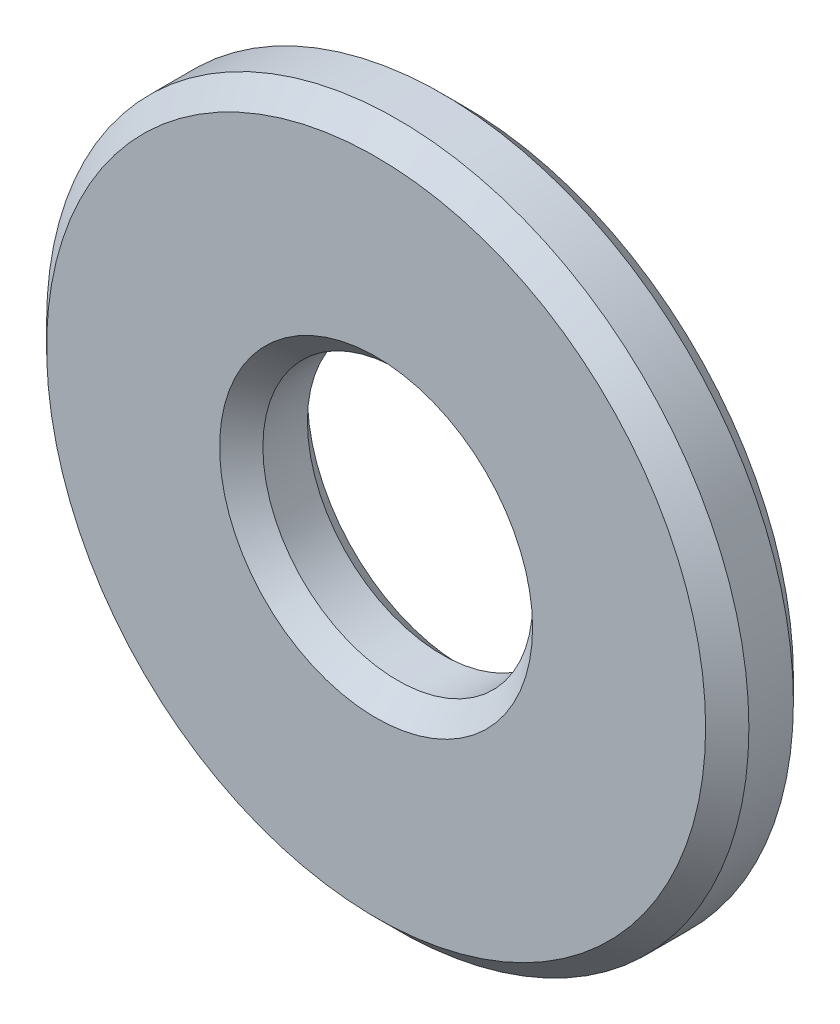
ISO-10303-21;
HEADER;
FILE_DESCRIPTION(('STEP AP214'),'2;1');
FILE_NAME('part.step','',(''),(''),'','','');
FILE_SCHEMA(('AUTOMOTIVE_DESIGN { 1 0 10303 214 1 1 1 1 }'));
ENDSEC;
DATA;
#1=APPLICATION_CONTEXT('core data for automotive mechanical design processes');
#2=APPLICATION_PROTOCOL_DEFINITION('international standard','automotive_design',2000,#1);
#3=PRODUCT_CONTEXT('',#1,'mechanical');
#4=PRODUCT('Part','Part','',(#3));
#5=PRODUCT_RELATED_PRODUCT_CATEGORY('part','',(#4));
#6=PRODUCT_DEFINITION_FORMATION('','',#4);
#7=PRODUCT_DEFINITION_CONTEXT('part definition',#1,'design');
#8=PRODUCT_DEFINITION('design','',#6,#7);
#9=PRODUCT_DEFINITION_SHAPE('','',#8);
#10=(LENGTH_UNIT() NAMED_UNIT(*) SI_UNIT(.MILLI.,.METRE.));
#11=(NAMED_UNIT(*) PLANE_ANGLE_UNIT() SI_UNIT($,.RADIAN.));
#12=(NAMED_UNIT(*) SI_UNIT($,.STERADIAN.) SOLID_ANGLE_UNIT());
#13=UNCERTAINTY_MEASURE_WITH_UNIT(LENGTH_MEASURE(1.E-05),#10,'distance_accuracy_value','');
#14=(GEOMETRIC_REPRESENTATION_CONTEXT(3) GLOBAL_UNCERTAINTY_ASSIGNED_CONTEXT((#13)) GLOBAL_UNIT_ASSIGNED_CONTEXT((#10,
#11,#12)) REPRESENTATION_CONTEXT('',''));
#15=CARTESIAN_POINT('',(0.,0.,0.));
#16=DIRECTION('',(0.,0.,1.));
#17=DIRECTION('',(1.,0.,0.));
#18=AXIS2_PLACEMENT_3D('',#15,#16,#17);
#19=CARTESIAN_POINT('',(0.,0.,-0.79375));
#20=DIRECTION('',(0.,0.,1.));
#21=DIRECTION('',(1.,0.,0.));
#22=AXIS2_PLACEMENT_3D('',#19,#20,#21);
#23=CYLINDRICAL_SURFACE('',#22,6.35);
#24=CARTESIAN_POINT('',(0.,0.,0.402590000000001));
#25=DIRECTION('',(0.,0.,1.));
#26=DIRECTION('',(1.,0.,0.));
#27=AXIS2_PLACEMENT_3D('',#24,#25,#26);
#28=CIRCLE('',#27,6.35);
#29=CARTESIAN_POINT('',(6.35,0.,0.402590000000001));
#30=VERTEX_POINT('',#29);
#31=EDGE_CURVE('E55',#30,#30,#28,.F.);
#32=ORIENTED_EDGE('',*,*,#31,.T.);
#33=EDGE_LOOP('',(#32));
#34=FACE_BOUND('',#33,.T.);
#35=CARTESIAN_POINT('',(0.,0.,-0.402590000000001));
#36=DIRECTION('',(0.,0.,1.));
#37=DIRECTION('',(1.,0.,0.));
#38=AXIS2_PLACEMENT_3D('',#35,#36,#37);
#39=CIRCLE('',#38,6.35);
#40=CARTESIAN_POINT('',(6.35,0.,-0.402590000000001));
#41=VERTEX_POINT('',#40);
#42=EDGE_CURVE('E58',#41,#41,#39,.T.);
#43=ORIENTED_EDGE('',*,*,#42,.T.);
#44=EDGE_LOOP('',(#43));
#45=FACE_BOUND('',#44,.T.);
#46=ADVANCED_FACE('F35',(#34,#45),#23,.T.);
#47=CARTESIAN_POINT('',(0.,0.,-0.79375));
#48=DIRECTION('',(0.,0.,1.));
#49=DIRECTION('',(1.,0.,0.));
#50=AXIS2_PLACEMENT_3D('',#47,#48,#49);
#51=PLANE('',#50);
#52=CARTESIAN_POINT('',(0.,0.,-0.79375));
#53=DIRECTION('',(0.,0.,1.));
#54=DIRECTION('',(1.,0.,0.));
#55=AXIS2_PLACEMENT_3D('',#52,#53,#54);
#56=CIRCLE('',#55,5.95884);
#57=CARTESIAN_POINT('',(5.95884,0.,-0.79375));
#58=VERTEX_POINT('',#57);
#59=EDGE_CURVE('E46',#58,#58,#56,.F.);
#60=ORIENTED_EDGE('',*,*,#59,.T.);
#61=EDGE_LOOP('',(#60));
#62=FACE_BOUND('',#61,.T.);
#63=CARTESIAN_POINT('',(0.,0.,-0.79375));
#64=DIRECTION('',(0.,0.,1.));
#65=DIRECTION('',(1.,0.,0.));
#66=AXIS2_PLACEMENT_3D('',#63,#64,#65);
#67=CIRCLE('',#66,2.82956000000001);
#68=CARTESIAN_POINT('',(2.82956000000001,0.,-0.79375));
#69=VERTEX_POINT('',#68);
#70=EDGE_CURVE('E50',#69,#69,#67,.T.);
#71=ORIENTED_EDGE('',*,*,#70,.T.);
#72=EDGE_LOOP('',(#71));
#73=FACE_BOUND('',#72,.T.);
#74=ADVANCED_FACE('F83',(#62,#73),#51,.F.);
#75=CARTESIAN_POINT('',(0.,0.,-0.79375));
#76=DIRECTION('',(0.,0.,1.));
#77=DIRECTION('',(1.,0.,0.));
#78=AXIS2_PLACEMENT_3D('',#75,#76,#77);
#79=CYLINDRICAL_SURFACE('',#78,2.4384);
#80=CARTESIAN_POINT('',(0.,0.,0.402590000000001));
#81=DIRECTION('',(0.,0.,1.));
#82=DIRECTION('',(1.,0.,0.));
#83=AXIS2_PLACEMENT_3D('',#80,#81,#82);
#84=CIRCLE('',#83,2.4384);
#85=CARTESIAN_POINT('',(2.4384,0.,0.402590000000001));
#86=VERTEX_POINT('',#85);
#87=EDGE_CURVE('E10',#86,#86,#84,.T.);
#88=ORIENTED_EDGE('',*,*,#87,.T.);
#89=EDGE_LOOP('',(#88));
#90=FACE_BOUND('',#89,.T.);
#91=CARTESIAN_POINT('',(0.,0.,-0.402589999999994));
#92=DIRECTION('',(0.,0.,1.));
#93=DIRECTION('',(1.,0.,0.));
#94=AXIS2_PLACEMENT_3D('',#91,#92,#93);
#95=CIRCLE('',#94,2.4384);
#96=CARTESIAN_POINT('',(2.4384,0.,-0.402589999999994));
#97=VERTEX_POINT('',#96);
#98=EDGE_CURVE('E42',#97,#97,#95,.F.);
#99=ORIENTED_EDGE('',*,*,#98,.T.);
#100=EDGE_LOOP('',(#99));
#101=FACE_BOUND('',#100,.T.);
#102=ADVANCED_FACE('F89',(#90,#101),#79,.F.);
#103=CARTESIAN_POINT('',(0.,0.,0.79375));
#104=DIRECTION('',(0.,0.,1.));
#105=DIRECTION('',(1.,0.,0.));
#106=AXIS2_PLACEMENT_3D('',#103,#104,#105);
#107=PLANE('',#106);
#108=CARTESIAN_POINT('',(0.,0.,0.79375));
#109=DIRECTION('',(0.,0.,1.));
#110=DIRECTION('',(1.,0.,0.));
#111=AXIS2_PLACEMENT_3D('',#108,#109,#110);
#112=CIRCLE('',#111,5.95884);
#113=CARTESIAN_POINT('',(5.95884,0.,0.79375));
#114=VERTEX_POINT('',#113);
#115=EDGE_CURVE('E61',#114,#114,#112,.T.);
#116=ORIENTED_EDGE('',*,*,#115,.T.);
#117=EDGE_LOOP('',(#116));
#118=FACE_BOUND('',#117,.T.);
#119=CARTESIAN_POINT('',(0.,0.,0.79375));
#120=DIRECTION('',(0.,0.,1.));
#121=DIRECTION('',(1.,0.,0.));
#122=AXIS2_PLACEMENT_3D('',#119,#120,#121);
#123=CIRCLE('',#122,2.82956);
#124=CARTESIAN_POINT('',(2.82956,0.,0.79375));
#125=VERTEX_POINT('',#124);
#126=EDGE_CURVE('E64',#125,#125,#123,.F.);
#127=ORIENTED_EDGE('',*,*,#126,.T.);
#128=EDGE_LOOP('',(#127));
#129=FACE_BOUND('',#128,.T.);
#130=ADVANCED_FACE('F68',(#118,#129),#107,.T.);
#131=CARTESIAN_POINT('',(0.,0.,0.79375));
#132=DIRECTION('',(0.,0.,-1.));
#133=DIRECTION('',(-1.,0.,0.));
#134=AXIS2_PLACEMENT_3D('',#131,#132,#133);
#135=CONICAL_SURFACE('',#134,5.95884,0.785398163397449);
#136=ORIENTED_EDGE('',*,*,#31,.F.);
#137=EDGE_LOOP('',(#136));
#138=FACE_BOUND('',#137,.T.);
#139=ORIENTED_EDGE('',*,*,#115,.F.);
#140=EDGE_LOOP('',(#139));
#141=FACE_BOUND('',#140,.T.);
#142=ADVANCED_FACE('F79',(#138,#141),#135,.T.);
#143=CARTESIAN_POINT('',(0.,0.,-0.402590000000001));
#144=DIRECTION('',(0.,0.,1.));
#145=DIRECTION('',(1.,0.,0.));
#146=AXIS2_PLACEMENT_3D('',#143,#144,#145);
#147=CONICAL_SURFACE('',#146,6.35,0.785398163397449);
#148=ORIENTED_EDGE('',*,*,#59,.F.);
#149=EDGE_LOOP('',(#148));
#150=FACE_BOUND('',#149,.T.);
#151=ORIENTED_EDGE('',*,*,#42,.F.);
#152=EDGE_LOOP('',(#151));
#153=FACE_BOUND('',#152,.T.);
#154=ADVANCED_FACE('F73',(#150,#153),#147,.T.);
#155=CARTESIAN_POINT('',(0.,0.,0.402590000000001));
#156=DIRECTION('',(0.,0.,1.));
#157=DIRECTION('',(1.,0.,0.));
#158=AXIS2_PLACEMENT_3D('',#155,#156,#157);
#159=CONICAL_SURFACE('',#158,2.4384,0.785398163397449);
#160=ORIENTED_EDGE('',*,*,#126,.F.);
#161=EDGE_LOOP('',(#160));
#162=FACE_BOUND('',#161,.T.);
#163=ORIENTED_EDGE('',*,*,#87,.F.);
#164=EDGE_LOOP('',(#163));
#165=FACE_BOUND('',#164,.T.);
#166=ADVANCED_FACE('F70',(#162,#165),#159,.F.);
#167=CARTESIAN_POINT('',(0.,0.,-0.79375));
#168=DIRECTION('',(0.,0.,-1.));
#169=DIRECTION('',(-1.,0.,0.));
#170=AXIS2_PLACEMENT_3D('',#167,#168,#169);
#171=CONICAL_SURFACE('',#170,2.82956000000001,0.785398163397447);
#172=ORIENTED_EDGE('',*,*,#98,.F.);
#173=EDGE_LOOP('',(#172));
#174=FACE_BOUND('',#173,.T.);
#175=ORIENTED_EDGE('',*,*,#70,.F.);
#176=EDGE_LOOP('',(#175));
#177=FACE_BOUND('',#176,.T.);
#178=ADVANCED_FACE('F37',(#174,#177),#171,.F.);
#179=CLOSED_SHELL('',(#46,#74,#102,#130,#142,#154,#166,#178));
#180=MANIFOLD_SOLID_BREP('B2',#179);
#181=ADVANCED_BREP_SHAPE_REPRESENTATION('',(#18,#180),#14);
#182=SHAPE_DEFINITION_REPRESENTATION(#9,#181);
ENDSEC;
END-ISO-10303-21;
